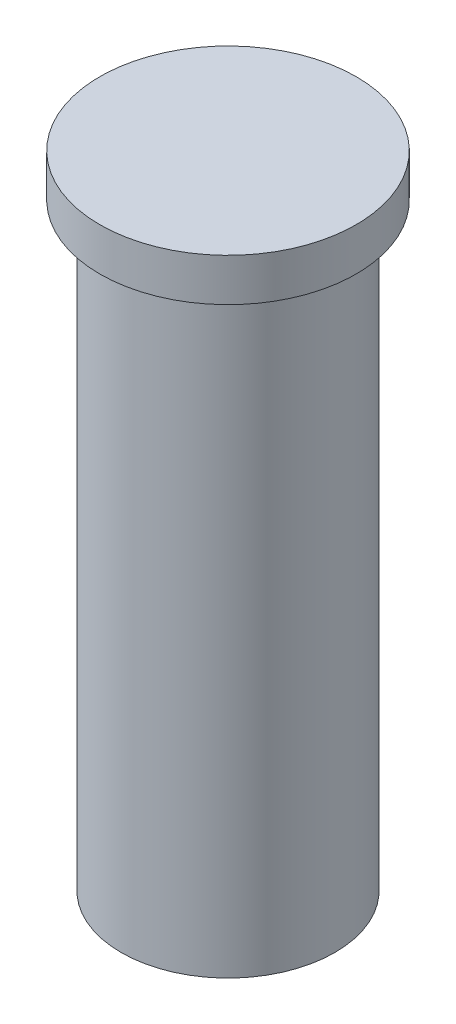
ISO-10303-21;
HEADER;
FILE_DESCRIPTION(('STEP AP214'),'2;1');
FILE_NAME('part.step','',(''),(''),'','','');
FILE_SCHEMA(('AUTOMOTIVE_DESIGN { 1 0 10303 214 1 1 1 1 }'));
ENDSEC;
DATA;
#1=APPLICATION_CONTEXT('core data for automotive mechanical design processes');
#2=APPLICATION_PROTOCOL_DEFINITION('international standard','automotive_design',2000,#1);
#3=PRODUCT_CONTEXT('',#1,'mechanical');
#4=PRODUCT('Part','Part','',(#3));
#5=PRODUCT_RELATED_PRODUCT_CATEGORY('part','',(#4));
#6=PRODUCT_DEFINITION_FORMATION('','',#4);
#7=PRODUCT_DEFINITION_CONTEXT('part definition',#1,'design');
#8=PRODUCT_DEFINITION('design','',#6,#7);
#9=PRODUCT_DEFINITION_SHAPE('','',#8);
#10=(LENGTH_UNIT() NAMED_UNIT(*) SI_UNIT(.MILLI.,.METRE.));
#11=(NAMED_UNIT(*) PLANE_ANGLE_UNIT() SI_UNIT($,.RADIAN.));
#12=(NAMED_UNIT(*) SI_UNIT($,.STERADIAN.) SOLID_ANGLE_UNIT());
#13=UNCERTAINTY_MEASURE_WITH_UNIT(LENGTH_MEASURE(1.E-05),#10,'distance_accuracy_value','');
#14=(GEOMETRIC_REPRESENTATION_CONTEXT(3) GLOBAL_UNCERTAINTY_ASSIGNED_CONTEXT((#13)) GLOBAL_UNIT_ASSIGNED_CONTEXT((#10,
#11,#12)) REPRESENTATION_CONTEXT('',''));
#15=CARTESIAN_POINT('',(0.,0.,0.));
#16=DIRECTION('',(0.,0.,1.));
#17=DIRECTION('',(1.,0.,0.));
#18=AXIS2_PLACEMENT_3D('',#15,#16,#17);
#19=CARTESIAN_POINT('',(0.,150.,0.));
#20=DIRECTION('',(0.,-1.,0.));
#21=DIRECTION('',(0.,0.,-1.));
#22=AXIS2_PLACEMENT_3D('',#19,#20,#21);
#23=CYLINDRICAL_SURFACE('',#22,25.);
#24=CARTESIAN_POINT('',(0.,0.,0.));
#25=DIRECTION('',(0.,1.,0.));
#26=DIRECTION('',(0.,0.,1.));
#27=AXIS2_PLACEMENT_3D('',#24,#25,#26);
#28=CIRCLE('',#27,25.);
#29=CARTESIAN_POINT('',(0.,0.,25.));
#30=VERTEX_POINT('',#29);
#31=EDGE_CURVE('E50',#30,#30,#28,.T.);
#32=ORIENTED_EDGE('',*,*,#31,.T.);
#33=EDGE_LOOP('',(#32));
#34=FACE_BOUND('',#33,.T.);
#35=CARTESIAN_POINT('',(0.,140.,0.));
#36=DIRECTION('',(0.,1.,0.));
#37=DIRECTION('',(0.,0.,1.));
#38=AXIS2_PLACEMENT_3D('',#35,#36,#37);
#39=CIRCLE('',#38,25.);
#40=CARTESIAN_POINT('',(0.,140.,25.));
#41=VERTEX_POINT('',#40);
#42=EDGE_CURVE('E10',#41,#41,#39,.T.);
#43=ORIENTED_EDGE('',*,*,#42,.F.);
#44=EDGE_LOOP('',(#43));
#45=FACE_BOUND('',#44,.T.);
#46=ADVANCED_FACE('F43',(#34,#45),#23,.T.);
#47=CARTESIAN_POINT('',(0.,0.,0.));
#48=DIRECTION('',(0.,1.,0.));
#49=DIRECTION('',(0.,0.,1.));
#50=AXIS2_PLACEMENT_3D('',#47,#48,#49);
#51=PLANE('',#50);
#52=ORIENTED_EDGE('',*,*,#31,.F.);
#53=EDGE_LOOP('',(#52));
#54=FACE_BOUND('',#53,.T.);
#55=ADVANCED_FACE('F72',(#54),#51,.F.);
#56=CARTESIAN_POINT('',(0.,140.,0.));
#57=DIRECTION('',(0.,1.,0.));
#58=DIRECTION('',(0.,0.,1.));
#59=AXIS2_PLACEMENT_3D('',#56,#57,#58);
#60=CYLINDRICAL_SURFACE('',#59,30.);
#61=CARTESIAN_POINT('',(0.,140.,0.));
#62=DIRECTION('',(0.,1.,0.));
#63=DIRECTION('',(0.,0.,1.));
#64=AXIS2_PLACEMENT_3D('',#61,#62,#63);
#65=CIRCLE('',#64,30.);
#66=CARTESIAN_POINT('',(0.,140.,30.));
#67=VERTEX_POINT('',#66);
#68=EDGE_CURVE('E56',#67,#67,#65,.T.);
#69=ORIENTED_EDGE('',*,*,#68,.T.);
#70=EDGE_LOOP('',(#69));
#71=FACE_BOUND('',#70,.T.);
#72=CARTESIAN_POINT('',(0.,150.,0.));
#73=DIRECTION('',(0.,1.,0.));
#74=DIRECTION('',(0.,0.,1.));
#75=AXIS2_PLACEMENT_3D('',#72,#73,#74);
#76=CIRCLE('',#75,30.);
#77=CARTESIAN_POINT('',(0.,150.,30.));
#78=VERTEX_POINT('',#77);
#79=EDGE_CURVE('E61',#78,#78,#76,.T.);
#80=ORIENTED_EDGE('',*,*,#79,.F.);
#81=EDGE_LOOP('',(#80));
#82=FACE_BOUND('',#81,.T.);
#83=ADVANCED_FACE('F69',(#71,#82),#60,.T.);
#84=CARTESIAN_POINT('',(0.,140.,0.));
#85=DIRECTION('',(0.,1.,0.));
#86=DIRECTION('',(0.,0.,1.));
#87=AXIS2_PLACEMENT_3D('',#84,#85,#86);
#88=PLANE('',#87);
#89=ORIENTED_EDGE('',*,*,#42,.T.);
#90=EDGE_LOOP('',(#89));
#91=FACE_BOUND('',#90,.T.);
#92=ORIENTED_EDGE('',*,*,#68,.F.);
#93=EDGE_LOOP('',(#92));
#94=FACE_BOUND('',#93,.T.);
#95=ADVANCED_FACE('F71',(#91,#94),#88,.F.);
#96=CARTESIAN_POINT('',(0.,150.,0.));
#97=DIRECTION('',(0.,1.,0.));
#98=DIRECTION('',(0.,0.,1.));
#99=AXIS2_PLACEMENT_3D('',#96,#97,#98);
#100=PLANE('',#99);
#101=ORIENTED_EDGE('',*,*,#79,.T.);
#102=EDGE_LOOP('',(#101));
#103=FACE_BOUND('',#102,.T.);
#104=ADVANCED_FACE('F67',(#103),#100,.T.);
#105=CLOSED_SHELL('',(#46,#55,#83,#95,#104));
#106=MANIFOLD_SOLID_BREP('B2',#105);
#107=ADVANCED_BREP_SHAPE_REPRESENTATION('',(#18,#106),#14);
#108=SHAPE_DEFINITION_REPRESENTATION(#9,#107);
ENDSEC;
END-ISO-10303-21;
